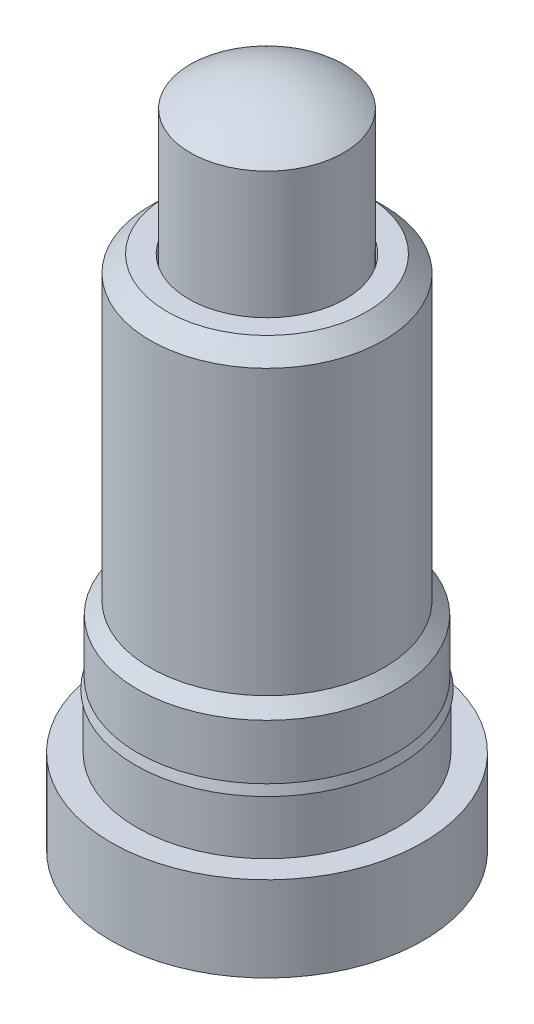
ISO-10303-21;
HEADER;
FILE_DESCRIPTION(('STEP AP214'),'2;1');
FILE_NAME('part.step','',(''),(''),'','','');
FILE_SCHEMA(('AUTOMOTIVE_DESIGN { 1 0 10303 214 1 1 1 1 }'));
ENDSEC;
DATA;
#1=APPLICATION_CONTEXT('core data for automotive mechanical design processes');
#2=APPLICATION_PROTOCOL_DEFINITION('international standard','automotive_design',2000,#1);
#3=PRODUCT_CONTEXT('',#1,'mechanical');
#4=PRODUCT('Part','Part','',(#3));
#5=PRODUCT_RELATED_PRODUCT_CATEGORY('part','',(#4));
#6=PRODUCT_DEFINITION_FORMATION('','',#4);
#7=PRODUCT_DEFINITION_CONTEXT('part definition',#1,'design');
#8=PRODUCT_DEFINITION('design','',#6,#7);
#9=PRODUCT_DEFINITION_SHAPE('','',#8);
#10=(LENGTH_UNIT() NAMED_UNIT(*) SI_UNIT(.MILLI.,.METRE.));
#11=(NAMED_UNIT(*) PLANE_ANGLE_UNIT() SI_UNIT($,.RADIAN.));
#12=(NAMED_UNIT(*) SI_UNIT($,.STERADIAN.) SOLID_ANGLE_UNIT());
#13=UNCERTAINTY_MEASURE_WITH_UNIT(LENGTH_MEASURE(1.E-05),#10,'distance_accuracy_value','');
#14=(GEOMETRIC_REPRESENTATION_CONTEXT(3) GLOBAL_UNCERTAINTY_ASSIGNED_CONTEXT((#13)) GLOBAL_UNIT_ASSIGNED_CONTEXT((#10,
#11,#12)) REPRESENTATION_CONTEXT('',''));
#15=CARTESIAN_POINT('',(0.,0.,0.));
#16=DIRECTION('',(0.,0.,1.));
#17=DIRECTION('',(1.,0.,0.));
#18=AXIS2_PLACEMENT_3D('',#15,#16,#17);
#19=CARTESIAN_POINT('',(0.,8.128,0.));
#20=DIRECTION('',(0.,-1.,0.));
#21=DIRECTION('',(-1.,0.,0.));
#22=AXIS2_PLACEMENT_3D('',#19,#20,#21);
#23=SPHERICAL_SURFACE('',#22,2.032);
#24=CARTESIAN_POINT('',(0.,9.79048772627048,0.));
#25=DIRECTION('',(0.,-1.,0.));
#26=DIRECTION('',(0.,0.,-1.));
#27=AXIS2_PLACEMENT_3D('',#24,#25,#26);
#28=CIRCLE('',#27,1.1684);
#29=CARTESIAN_POINT('',(0.,9.79048772627048,-1.1684));
#30=VERTEX_POINT('',#29);
#31=EDGE_CURVE('E12',#30,#30,#28,.T.);
#32=ORIENTED_EDGE('',*,*,#31,.F.);
#33=EDGE_LOOP('',(#32));
#34=FACE_BOUND('',#33,.T.);
#35=ADVANCED_FACE('F43',(#34),#23,.T.);
#36=CARTESIAN_POINT('',(0.,-1.38329411299765,0.));
#37=DIRECTION('',(0.,-1.,0.));
#38=DIRECTION('',(0.,0.,-1.));
#39=AXIS2_PLACEMENT_3D('',#36,#37,#38);
#40=CYLINDRICAL_SURFACE('',#39,1.1684);
#41=CARTESIAN_POINT('',(0.,6.7691,0.));
#42=DIRECTION('',(0.,-1.,0.));
#43=DIRECTION('',(0.,0.,-1.));
#44=AXIS2_PLACEMENT_3D('',#41,#42,#43);
#45=CIRCLE('',#44,1.1684);
#46=CARTESIAN_POINT('',(0.,6.7691,-1.1684));
#47=VERTEX_POINT('',#46);
#48=EDGE_CURVE('E49',#47,#47,#45,.T.);
#49=ORIENTED_EDGE('',*,*,#48,.F.);
#50=EDGE_LOOP('',(#49));
#51=FACE_BOUND('',#50,.T.);
#52=ORIENTED_EDGE('',*,*,#31,.T.);
#53=EDGE_LOOP('',(#52));
#54=FACE_BOUND('',#53,.T.);
#55=ADVANCED_FACE('F76',(#51,#54),#40,.T.);
#56=CARTESIAN_POINT('',(0.,6.7691,0.));
#57=DIRECTION('',(0.,-1.,0.));
#58=DIRECTION('',(0.,0.,-1.));
#59=AXIS2_PLACEMENT_3D('',#56,#57,#58);
#60=CONICAL_SURFACE('',#59,1.1684,0.785398163397449);
#61=CARTESIAN_POINT('',(0.,6.604,0.));
#62=DIRECTION('',(0.,-1.,0.));
#63=DIRECTION('',(0.,0.,-1.));
#64=AXIS2_PLACEMENT_3D('',#61,#62,#63);
#65=CIRCLE('',#64,1.3335);
#66=CARTESIAN_POINT('',(0.,6.604,-1.3335));
#67=VERTEX_POINT('',#66);
#68=EDGE_CURVE('E69',#67,#67,#65,.T.);
#69=ORIENTED_EDGE('',*,*,#68,.F.);
#70=EDGE_LOOP('',(#69));
#71=FACE_BOUND('',#70,.T.);
#72=ORIENTED_EDGE('',*,*,#48,.T.);
#73=EDGE_LOOP('',(#72));
#74=FACE_BOUND('',#73,.T.);
#75=ADVANCED_FACE('F74',(#71,#74),#60,.T.);
#76=CARTESIAN_POINT('',(0.,-1.38329411299765,0.));
#77=DIRECTION('',(0.,-1.,0.));
#78=DIRECTION('',(0.,0.,-1.));
#79=AXIS2_PLACEMENT_3D('',#76,#77,#78);
#80=CYLINDRICAL_SURFACE('',#79,1.3335);
#81=CARTESIAN_POINT('',(0.,5.842,0.));
#82=DIRECTION('',(0.,-1.,0.));
#83=DIRECTION('',(0.,0.,-1.));
#84=AXIS2_PLACEMENT_3D('',#81,#82,#83);
#85=CIRCLE('',#84,1.3335);
#86=CARTESIAN_POINT('',(0.,5.842,-1.3335));
#87=VERTEX_POINT('',#86);
#88=EDGE_CURVE('E64',#87,#87,#85,.T.);
#89=ORIENTED_EDGE('',*,*,#88,.F.);
#90=EDGE_LOOP('',(#89));
#91=FACE_BOUND('',#90,.T.);
#92=ORIENTED_EDGE('',*,*,#68,.T.);
#93=EDGE_LOOP('',(#92));
#94=FACE_BOUND('',#93,.T.);
#95=ADVANCED_FACE('F94',(#91,#94),#80,.T.);
#96=CARTESIAN_POINT('',(-1.3335,5.842,0.));
#97=DIRECTION('',(0.,1.,0.));
#98=DIRECTION('',(0.,0.,1.));
#99=AXIS2_PLACEMENT_3D('',#96,#97,#98);
#100=PLANE('',#99);
#101=CARTESIAN_POINT('',(0.,5.842,0.));
#102=DIRECTION('',(0.,-1.,0.));
#103=DIRECTION('',(0.,0.,-1.));
#104=AXIS2_PLACEMENT_3D('',#101,#102,#103);
#105=CIRCLE('',#104,1.0414);
#106=CARTESIAN_POINT('',(0.,5.842,-1.0414));
#107=VERTEX_POINT('',#106);
#108=EDGE_CURVE('E61',#107,#107,#105,.T.);
#109=ORIENTED_EDGE('',*,*,#108,.F.);
#110=EDGE_LOOP('',(#109));
#111=FACE_BOUND('',#110,.T.);
#112=ORIENTED_EDGE('',*,*,#88,.T.);
#113=EDGE_LOOP('',(#112));
#114=FACE_BOUND('',#113,.T.);
#115=ADVANCED_FACE('F102',(#111,#114),#100,.F.);
#116=CARTESIAN_POINT('',(0.,-1.38329411299765,0.));
#117=DIRECTION('',(0.,-1.,0.));
#118=DIRECTION('',(0.,0.,-1.));
#119=AXIS2_PLACEMENT_3D('',#116,#117,#118);
#120=CYLINDRICAL_SURFACE('',#119,1.0414);
#121=CARTESIAN_POINT('',(0.,8.28874742966593,0.));
#122=DIRECTION('',(0.,-1.,0.));
#123=DIRECTION('',(0.,0.,-1.));
#124=AXIS2_PLACEMENT_3D('',#121,#122,#123);
#125=CIRCLE('',#124,1.0414);
#126=CARTESIAN_POINT('',(0.,8.28874742966593,-1.0414));
#127=VERTEX_POINT('',#126);
#128=EDGE_CURVE('E59',#127,#127,#125,.T.);
#129=ORIENTED_EDGE('',*,*,#128,.F.);
#130=EDGE_LOOP('',(#129));
#131=FACE_BOUND('',#130,.T.);
#132=ORIENTED_EDGE('',*,*,#108,.T.);
#133=EDGE_LOOP('',(#132));
#134=FACE_BOUND('',#133,.T.);
#135=ADVANCED_FACE('F55',(#131,#134),#120,.F.);
#136=CARTESIAN_POINT('',(0.,8.28874742966593,0.));
#137=DIRECTION('',(0.,-1.,0.));
#138=DIRECTION('',(0.,0.,-1.));
#139=AXIS2_PLACEMENT_3D('',#136,#137,#138);
#140=CONICAL_SURFACE('',#139,1.0414,1.0471975511966);
#141=CARTESIAN_POINT('',(0.,8.89,0.));
#142=VERTEX_POINT('',#141);
#143=VERTEX_LOOP('',#142);
#144=FACE_BOUND('',#143,.T.);
#145=ORIENTED_EDGE('',*,*,#128,.T.);
#146=EDGE_LOOP('',(#145));
#147=FACE_BOUND('',#146,.T.);
#148=ADVANCED_FACE('F52',(#144,#147),#140,.F.);
#149=CLOSED_SHELL('',(#35,#55,#75,#95,#115,#135,#148));
#150=MANIFOLD_SOLID_BREP('B2',#149);
#151=CARTESIAN_POINT('',(0.,-1.38329411299765,0.));
#152=DIRECTION('',(0.,-1.,0.));
#153=DIRECTION('',(0.,0.,-1.));
#154=AXIS2_PLACEMENT_3D('',#151,#152,#153);
#155=CYLINDRICAL_SURFACE('',#154,1.3589);
#156=CARTESIAN_POINT('',(0.,6.5786,0.));
#157=DIRECTION('',(0.,-1.,0.));
#158=DIRECTION('',(0.,0.,-1.));
#159=AXIS2_PLACEMENT_3D('',#156,#157,#158);
#160=CIRCLE('',#159,1.3589);
#161=CARTESIAN_POINT('',(0.,6.5786,-1.3589));
#162=VERTEX_POINT('',#161);
#163=EDGE_CURVE('E193',#162,#162,#160,.T.);
#164=ORIENTED_EDGE('',*,*,#163,.F.);
#165=EDGE_LOOP('',(#164));
#166=FACE_BOUND('',#165,.T.);
#167=CARTESIAN_POINT('',(0.,0.762,0.));
#168=DIRECTION('',(0.,-1.,0.));
#169=DIRECTION('',(0.,0.,-1.));
#170=AXIS2_PLACEMENT_3D('',#167,#168,#169);
#171=CIRCLE('',#170,1.3589);
#172=CARTESIAN_POINT('',(0.,0.762,-1.3589));
#173=VERTEX_POINT('',#172);
#174=EDGE_CURVE('E42',#173,#173,#171,.F.);
#175=ORIENTED_EDGE('',*,*,#174,.F.);
#176=EDGE_LOOP('',(#175));
#177=FACE_BOUND('',#176,.T.);
#178=ADVANCED_FACE('F146',(#166,#177),#155,.F.);
#179=CARTESIAN_POINT('',(0.,6.5786,0.));
#180=DIRECTION('',(0.,-1.,0.));
#181=DIRECTION('',(0.,0.,-1.));
#182=AXIS2_PLACEMENT_3D('',#179,#180,#181);
#183=CONICAL_SURFACE('',#182,1.3589,0.785398163397449);
#184=CARTESIAN_POINT('',(0.,6.7437,0.));
#185=DIRECTION('',(0.,-1.,0.));
#186=DIRECTION('',(0.,0.,-1.));
#187=AXIS2_PLACEMENT_3D('',#184,#185,#186);
#188=CIRCLE('',#187,1.1938);
#189=CARTESIAN_POINT('',(0.,6.7437,-1.1938));
#190=VERTEX_POINT('',#189);
#191=EDGE_CURVE('E153',#190,#190,#188,.T.);
#192=ORIENTED_EDGE('',*,*,#191,.F.);
#193=EDGE_LOOP('',(#192));
#194=FACE_BOUND('',#193,.T.);
#195=ORIENTED_EDGE('',*,*,#163,.T.);
#196=EDGE_LOOP('',(#195));
#197=FACE_BOUND('',#196,.T.);
#198=ADVANCED_FACE('F148',(#194,#197),#183,.F.);
#199=CARTESIAN_POINT('',(0.,-1.38329411299765,0.));
#200=DIRECTION('',(0.,-1.,0.));
#201=DIRECTION('',(0.,0.,-1.));
#202=AXIS2_PLACEMENT_3D('',#199,#200,#201);
#203=CYLINDRICAL_SURFACE('',#202,1.1938);
#204=CARTESIAN_POINT('',(0.,7.874,0.));
#205=DIRECTION('',(0.,-1.,0.));
#206=DIRECTION('',(0.,0.,-1.));
#207=AXIS2_PLACEMENT_3D('',#204,#205,#206);
#208=CIRCLE('',#207,1.1938);
#209=CARTESIAN_POINT('',(0.,7.874,-1.1938));
#210=VERTEX_POINT('',#209);
#211=EDGE_CURVE('E157',#210,#210,#208,.T.);
#212=ORIENTED_EDGE('',*,*,#211,.F.);
#213=EDGE_LOOP('',(#212));
#214=FACE_BOUND('',#213,.T.);
#215=ORIENTED_EDGE('',*,*,#191,.T.);
#216=EDGE_LOOP('',(#215));
#217=FACE_BOUND('',#216,.T.);
#218=ADVANCED_FACE('F204',(#214,#217),#203,.F.);
#219=CARTESIAN_POINT('',(-1.524,7.874,0.));
#220=DIRECTION('',(0.,-1.,0.));
#221=DIRECTION('',(0.,0.,-1.));
#222=AXIS2_PLACEMENT_3D('',#219,#220,#221);
#223=PLANE('',#222);
#224=CARTESIAN_POINT('',(0.,7.874,0.));
#225=DIRECTION('',(0.,-1.,0.));
#226=DIRECTION('',(0.,0.,-1.));
#227=AXIS2_PLACEMENT_3D('',#224,#225,#226);
#228=CIRCLE('',#227,1.524);
#229=CARTESIAN_POINT('',(0.,7.874,-1.524));
#230=VERTEX_POINT('',#229);
#231=EDGE_CURVE('E161',#230,#230,#228,.T.);
#232=ORIENTED_EDGE('',*,*,#231,.F.);
#233=EDGE_LOOP('',(#232));
#234=FACE_BOUND('',#233,.T.);
#235=ORIENTED_EDGE('',*,*,#211,.T.);
#236=EDGE_LOOP('',(#235));
#237=FACE_BOUND('',#236,.T.);
#238=ADVANCED_FACE('F248',(#234,#237),#223,.F.);
#239=CARTESIAN_POINT('',(0.,7.874,0.));
#240=DIRECTION('',(0.,-1.,0.));
#241=DIRECTION('',(0.,0.,-1.));
#242=AXIS2_PLACEMENT_3D('',#239,#240,#241);
#243=CONICAL_SURFACE('',#242,1.524,0.785398163397447);
#244=CARTESIAN_POINT('',(0.,7.62,0.));
#245=DIRECTION('',(0.,-1.,0.));
#246=DIRECTION('',(0.,0.,-1.));
#247=AXIS2_PLACEMENT_3D('',#244,#245,#246);
#248=CIRCLE('',#247,1.778);
#249=CARTESIAN_POINT('',(0.,7.62,-1.778));
#250=VERTEX_POINT('',#249);
#251=EDGE_CURVE('E166',#250,#250,#248,.T.);
#252=ORIENTED_EDGE('',*,*,#251,.F.);
#253=EDGE_LOOP('',(#252));
#254=FACE_BOUND('',#253,.T.);
#255=ORIENTED_EDGE('',*,*,#231,.T.);
#256=EDGE_LOOP('',(#255));
#257=FACE_BOUND('',#256,.T.);
#258=ADVANCED_FACE('F244',(#254,#257),#243,.T.);
#259=CARTESIAN_POINT('',(0.,-1.38329411299765,0.));
#260=DIRECTION('',(0.,-1.,0.));
#261=DIRECTION('',(0.,0.,-1.));
#262=AXIS2_PLACEMENT_3D('',#259,#260,#261);
#263=CYLINDRICAL_SURFACE('',#262,1.778);
#264=CARTESIAN_POINT('',(0.,3.302,0.));
#265=DIRECTION('',(0.,-1.,0.));
#266=DIRECTION('',(0.,0.,-1.));
#267=AXIS2_PLACEMENT_3D('',#264,#265,#266);
#268=CIRCLE('',#267,1.778);
#269=CARTESIAN_POINT('',(0.,3.302,-1.778));
#270=VERTEX_POINT('',#269);
#271=EDGE_CURVE('E169',#270,#270,#268,.T.);
#272=ORIENTED_EDGE('',*,*,#271,.F.);
#273=EDGE_LOOP('',(#272));
#274=FACE_BOUND('',#273,.T.);
#275=ORIENTED_EDGE('',*,*,#251,.T.);
#276=EDGE_LOOP('',(#275));
#277=FACE_BOUND('',#276,.T.);
#278=ADVANCED_FACE('F240',(#274,#277),#263,.T.);
#279=CARTESIAN_POINT('',(0.,3.302,0.));
#280=DIRECTION('',(0.,-1.,0.));
#281=DIRECTION('',(0.,0.,-1.));
#282=AXIS2_PLACEMENT_3D('',#279,#280,#281);
#283=CONICAL_SURFACE('',#282,1.778,0.785398163397444);
#284=CARTESIAN_POINT('',(0.,3.1115,0.));
#285=DIRECTION('',(0.,-1.,0.));
#286=DIRECTION('',(0.,0.,-1.));
#287=AXIS2_PLACEMENT_3D('',#284,#285,#286);
#288=CIRCLE('',#287,1.9685);
#289=CARTESIAN_POINT('',(0.,3.1115,-1.9685));
#290=VERTEX_POINT('',#289);
#291=EDGE_CURVE('E172',#290,#290,#288,.T.);
#292=ORIENTED_EDGE('',*,*,#291,.F.);
#293=EDGE_LOOP('',(#292));
#294=FACE_BOUND('',#293,.T.);
#295=ORIENTED_EDGE('',*,*,#271,.T.);
#296=EDGE_LOOP('',(#295));
#297=FACE_BOUND('',#296,.T.);
#298=ADVANCED_FACE('F236',(#294,#297),#283,.T.);
#299=CARTESIAN_POINT('',(0.,-1.38329411299765,0.));
#300=DIRECTION('',(0.,-1.,0.));
#301=DIRECTION('',(0.,0.,-1.));
#302=AXIS2_PLACEMENT_3D('',#299,#300,#301);
#303=CYLINDRICAL_SURFACE('',#302,1.9685);
#304=CARTESIAN_POINT('',(0.,2.27454556788419,0.));
#305=DIRECTION('',(0.,-1.,0.));
#306=DIRECTION('',(0.,0.,-1.));
#307=AXIS2_PLACEMENT_3D('',#304,#305,#306);
#308=CIRCLE('',#307,1.9685);
#309=CARTESIAN_POINT('',(0.,2.27454556788419,-1.9685));
#310=VERTEX_POINT('',#309);
#311=EDGE_CURVE('E175',#310,#310,#308,.T.);
#312=ORIENTED_EDGE('',*,*,#311,.F.);
#313=EDGE_LOOP('',(#312));
#314=FACE_BOUND('',#313,.T.);
#315=ORIENTED_EDGE('',*,*,#291,.T.);
#316=EDGE_LOOP('',(#315));
#317=FACE_BOUND('',#316,.T.);
#318=ADVANCED_FACE('F232',(#314,#317),#303,.T.);
#319=CARTESIAN_POINT('',(0.,2.27454556788419,0.));
#320=DIRECTION('',(0.,-1.,0.));
#321=DIRECTION('',(0.,0.,-1.));
#322=AXIS2_PLACEMENT_3D('',#319,#320,#321);
#323=CONICAL_SURFACE('',#322,1.9685,0.261799387799143);
#324=CARTESIAN_POINT('',(0.,2.13235443211581,0.));
#325=DIRECTION('',(0.,-1.,0.));
#326=DIRECTION('',(0.,0.,-1.));
#327=AXIS2_PLACEMENT_3D('',#324,#325,#326);
#328=CIRCLE('',#327,2.0066);
#329=CARTESIAN_POINT('',(0.,2.13235443211581,-2.0066));
#330=VERTEX_POINT('',#329);
#331=EDGE_CURVE('E178',#330,#330,#328,.T.);
#332=ORIENTED_EDGE('',*,*,#331,.F.);
#333=EDGE_LOOP('',(#332));
#334=FACE_BOUND('',#333,.T.);
#335=ORIENTED_EDGE('',*,*,#311,.T.);
#336=EDGE_LOOP('',(#335));
#337=FACE_BOUND('',#336,.T.);
#338=ADVANCED_FACE('F228',(#334,#337),#323,.T.);
#339=CARTESIAN_POINT('',(-2.0066,2.13235443211581,0.));
#340=DIRECTION('',(0.,1.,0.));
#341=DIRECTION('',(0.,0.,1.));
#342=AXIS2_PLACEMENT_3D('',#339,#340,#341);
#343=PLANE('',#342);
#344=CARTESIAN_POINT('',(0.,2.13235443211581,0.));
#345=DIRECTION('',(0.,-1.,0.));
#346=DIRECTION('',(0.,0.,-1.));
#347=AXIS2_PLACEMENT_3D('',#344,#345,#346);
#348=CIRCLE('',#347,1.9812);
#349=CARTESIAN_POINT('',(0.,2.13235443211581,-1.9812));
#350=VERTEX_POINT('',#349);
#351=EDGE_CURVE('E181',#350,#350,#348,.T.);
#352=ORIENTED_EDGE('',*,*,#351,.F.);
#353=EDGE_LOOP('',(#352));
#354=FACE_BOUND('',#353,.T.);
#355=ORIENTED_EDGE('',*,*,#331,.T.);
#356=EDGE_LOOP('',(#355));
#357=FACE_BOUND('',#356,.T.);
#358=ADVANCED_FACE('F224',(#354,#357),#343,.F.);
#359=CARTESIAN_POINT('',(0.,-1.38329411299765,0.));
#360=DIRECTION('',(0.,-1.,0.));
#361=DIRECTION('',(0.,0.,-1.));
#362=AXIS2_PLACEMENT_3D('',#359,#360,#361);
#363=CYLINDRICAL_SURFACE('',#362,1.9812);
#364=CARTESIAN_POINT('',(0.,1.2954,0.));
#365=DIRECTION('',(0.,-1.,0.));
#366=DIRECTION('',(0.,0.,-1.));
#367=AXIS2_PLACEMENT_3D('',#364,#365,#366);
#368=CIRCLE('',#367,1.9812);
#369=CARTESIAN_POINT('',(0.,1.2954,-1.9812));
#370=VERTEX_POINT('',#369);
#371=EDGE_CURVE('E184',#370,#370,#368,.T.);
#372=ORIENTED_EDGE('',*,*,#371,.F.);
#373=EDGE_LOOP('',(#372));
#374=FACE_BOUND('',#373,.T.);
#375=ORIENTED_EDGE('',*,*,#351,.T.);
#376=EDGE_LOOP('',(#375));
#377=FACE_BOUND('',#376,.T.);
#378=ADVANCED_FACE('F220',(#374,#377),#363,.T.);
#379=CARTESIAN_POINT('',(-2.3749,1.2954,0.));
#380=DIRECTION('',(0.,-1.,0.));
#381=DIRECTION('',(0.,0.,-1.));
#382=AXIS2_PLACEMENT_3D('',#379,#380,#381);
#383=PLANE('',#382);
#384=CARTESIAN_POINT('',(0.,1.2954,0.));
#385=DIRECTION('',(0.,-1.,0.));
#386=DIRECTION('',(0.,0.,-1.));
#387=AXIS2_PLACEMENT_3D('',#384,#385,#386);
#388=CIRCLE('',#387,2.3749);
#389=CARTESIAN_POINT('',(0.,1.2954,-2.3749));
#390=VERTEX_POINT('',#389);
#391=EDGE_CURVE('E187',#390,#390,#388,.T.);
#392=ORIENTED_EDGE('',*,*,#391,.F.);
#393=EDGE_LOOP('',(#392));
#394=FACE_BOUND('',#393,.T.);
#395=ORIENTED_EDGE('',*,*,#371,.T.);
#396=EDGE_LOOP('',(#395));
#397=FACE_BOUND('',#396,.T.);
#398=ADVANCED_FACE('F216',(#394,#397),#383,.F.);
#399=CARTESIAN_POINT('',(0.,-1.38329411299765,0.));
#400=DIRECTION('',(0.,-1.,0.));
#401=DIRECTION('',(0.,0.,-1.));
#402=AXIS2_PLACEMENT_3D('',#399,#400,#401);
#403=CYLINDRICAL_SURFACE('',#402,2.3749);
#404=CARTESIAN_POINT('',(0.,0.,0.));
#405=DIRECTION('',(0.,-1.,0.));
#406=DIRECTION('',(0.,0.,-1.));
#407=AXIS2_PLACEMENT_3D('',#404,#405,#406);
#408=CIRCLE('',#407,2.3749);
#409=CARTESIAN_POINT('',(0.,0.,-2.3749));
#410=VERTEX_POINT('',#409);
#411=EDGE_CURVE('E190',#410,#410,#408,.T.);
#412=ORIENTED_EDGE('',*,*,#411,.F.);
#413=EDGE_LOOP('',(#412));
#414=FACE_BOUND('',#413,.T.);
#415=ORIENTED_EDGE('',*,*,#391,.T.);
#416=EDGE_LOOP('',(#415));
#417=FACE_BOUND('',#416,.T.);
#418=ADVANCED_FACE('F212',(#414,#417),#403,.T.);
#419=CARTESIAN_POINT('',(-2.3749,0.,0.));
#420=DIRECTION('',(0.,1.,0.));
#421=DIRECTION('',(0.,0.,1.));
#422=AXIS2_PLACEMENT_3D('',#419,#420,#421);
#423=PLANE('',#422);
#424=ORIENTED_EDGE('',*,*,#411,.T.);
#425=EDGE_LOOP('',(#424));
#426=FACE_BOUND('',#425,.T.);
#427=ADVANCED_FACE('F209',(#426),#423,.F.);
#428=CARTESIAN_POINT('',(0.,0.762,0.));
#429=DIRECTION('',(0.,-1.,0.));
#430=DIRECTION('',(0.,0.,-1.));
#431=AXIS2_PLACEMENT_3D('',#428,#429,#430);
#432=PLANE('',#431);
#433=ORIENTED_EDGE('',*,*,#174,.T.);
#434=EDGE_LOOP('',(#433));
#435=FACE_BOUND('',#434,.T.);
#436=ADVANCED_FACE('F208',(#435),#432,.F.);
#437=CLOSED_SHELL('',(#178,#198,#218,#238,#258,#278,#298,#318,#338,#358,#378,#398,#418,#427,#436));
#438=MANIFOLD_SOLID_BREP('B6',#437);
#439=ADVANCED_BREP_SHAPE_REPRESENTATION('',(#18,#150,#438),#14);
#440=SHAPE_DEFINITION_REPRESENTATION(#9,#439);
ENDSEC;
END-ISO-10303-21;
